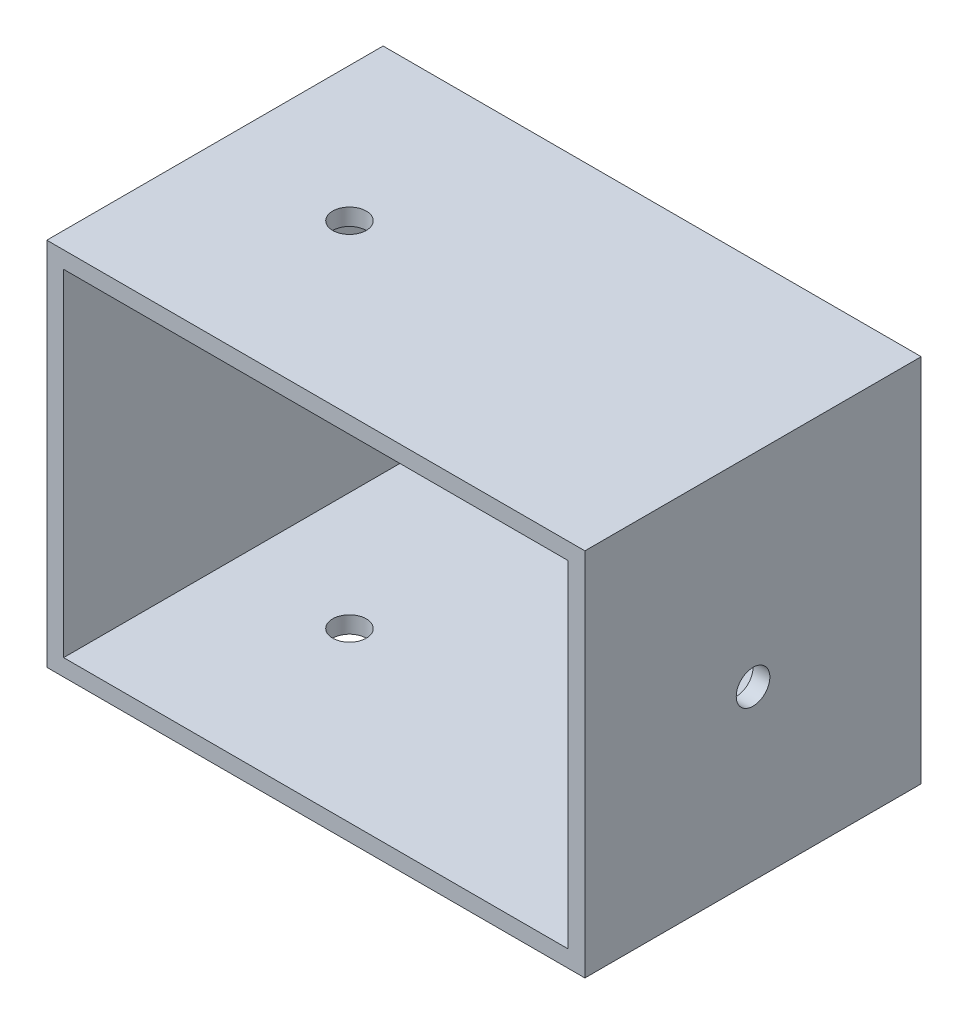
ISO-10303-21;
HEADER;
FILE_DESCRIPTION(('STEP AP214'),'2;1');
FILE_NAME('part.step','',(''),(''),'','','');
FILE_SCHEMA(('AUTOMOTIVE_DESIGN { 1 0 10303 214 1 1 1 1 }'));
ENDSEC;
DATA;
#1=APPLICATION_CONTEXT('core data for automotive mechanical design processes');
#2=APPLICATION_PROTOCOL_DEFINITION('international standard','automotive_design',2000,#1);
#3=PRODUCT_CONTEXT('',#1,'mechanical');
#4=PRODUCT('Part','Part','',(#3));
#5=PRODUCT_RELATED_PRODUCT_CATEGORY('part','',(#4));
#6=PRODUCT_DEFINITION_FORMATION('','',#4);
#7=PRODUCT_DEFINITION_CONTEXT('part definition',#1,'design');
#8=PRODUCT_DEFINITION('design','',#6,#7);
#9=PRODUCT_DEFINITION_SHAPE('','',#8);
#10=(LENGTH_UNIT() NAMED_UNIT(*) SI_UNIT(.MILLI.,.METRE.));
#11=(NAMED_UNIT(*) PLANE_ANGLE_UNIT() SI_UNIT($,.RADIAN.));
#12=(NAMED_UNIT(*) SI_UNIT($,.STERADIAN.) SOLID_ANGLE_UNIT());
#13=UNCERTAINTY_MEASURE_WITH_UNIT(LENGTH_MEASURE(1.E-05),#10,'distance_accuracy_value','');
#14=(GEOMETRIC_REPRESENTATION_CONTEXT(3) GLOBAL_UNCERTAINTY_ASSIGNED_CONTEXT((#13)) GLOBAL_UNIT_ASSIGNED_CONTEXT((#10,
#11,#12)) REPRESENTATION_CONTEXT('',''));
#15=CARTESIAN_POINT('',(0.,0.,0.));
#16=DIRECTION('',(0.,0.,1.));
#17=DIRECTION('',(1.,0.,0.));
#18=AXIS2_PLACEMENT_3D('',#15,#16,#17);
#19=CARTESIAN_POINT('',(0.,-5.,100.));
#20=DIRECTION('',(0.,1.,0.));
#21=DIRECTION('',(0.,0.,1.));
#22=AXIS2_PLACEMENT_3D('',#19,#20,#21);
#23=PLANE('',#22);
#24=CARTESIAN_POINT('',(40.,-5.,50.));
#25=DIRECTION('',(0.,1.,0.));
#26=DIRECTION('',(0.,0.,1.));
#27=AXIS2_PLACEMENT_3D('',#24,#25,#26);
#28=CIRCLE('',#27,5.00000000000001);
#29=CARTESIAN_POINT('',(40.,-5.00000000000003,45.));
#30=VERTEX_POINT('',#29);
#31=EDGE_CURVE('E139',#30,#30,#28,.T.);
#32=ORIENTED_EDGE('',*,*,#31,.T.);
#33=EDGE_LOOP('',(#32));
#34=FACE_BOUND('',#33,.T.);
#35=DIRECTION('',(1.,0.,0.));
#36=VECTOR('',#35,1.);
#37=CARTESIAN_POINT('',(0.,-5.,0.));
#38=LINE('',#37,#36);
#39=CARTESIAN_POINT('',(5.,-5.,0.));
#40=VERTEX_POINT('',#39);
#41=CARTESIAN_POINT('',(155.,-5.,0.));
#42=VERTEX_POINT('',#41);
#43=EDGE_CURVE('E147',#40,#42,#38,.T.);
#44=ORIENTED_EDGE('',*,*,#43,.T.);
#45=DIRECTION('',(0.,0.,-1.));
#46=VECTOR('',#45,1.);
#47=CARTESIAN_POINT('',(155.,-5.,100.));
#48=LINE('',#47,#46);
#49=CARTESIAN_POINT('',(155.,-5.,100.));
#50=VERTEX_POINT('',#49);
#51=EDGE_CURVE('E11',#50,#42,#48,.T.);
#52=ORIENTED_EDGE('',*,*,#51,.F.);
#53=DIRECTION('',(1.,0.,0.));
#54=VECTOR('',#53,1.);
#55=CARTESIAN_POINT('',(0.,-5.,100.));
#56=LINE('',#55,#54);
#57=CARTESIAN_POINT('',(5.,-5.,100.));
#58=VERTEX_POINT('',#57);
#59=EDGE_CURVE('E118',#58,#50,#56,.T.);
#60=ORIENTED_EDGE('',*,*,#59,.F.);
#61=DIRECTION('',(0.,0.,-1.));
#62=VECTOR('',#61,1.);
#63=CARTESIAN_POINT('',(5.,-5.,100.));
#64=LINE('',#63,#62);
#65=EDGE_CURVE('E58',#58,#40,#64,.T.);
#66=ORIENTED_EDGE('',*,*,#65,.T.);
#67=EDGE_LOOP('',(#44,#52,#60,#66));
#68=FACE_BOUND('',#67,.T.);
#69=ADVANCED_FACE('F39',(#34,#68),#23,.F.);
#70=CARTESIAN_POINT('',(155.,0.,100.));
#71=DIRECTION('',(1.,0.,0.));
#72=DIRECTION('',(0.,1.,0.));
#73=AXIS2_PLACEMENT_3D('',#70,#71,#72);
#74=PLANE('',#73);
#75=CARTESIAN_POINT('',(155.,-60.,50.));
#76=DIRECTION('',(1.,0.,0.));
#77=DIRECTION('',(0.,1.,0.));
#78=AXIS2_PLACEMENT_3D('',#75,#76,#77);
#79=CIRCLE('',#78,5.);
#80=CARTESIAN_POINT('',(155.,-55.,50.));
#81=VERTEX_POINT('',#80);
#82=EDGE_CURVE('E200',#81,#81,#79,.T.);
#83=ORIENTED_EDGE('',*,*,#82,.T.);
#84=EDGE_LOOP('',(#83));
#85=FACE_BOUND('',#84,.T.);
#86=DIRECTION('',(0.,-1.,0.));
#87=VECTOR('',#86,1.);
#88=CARTESIAN_POINT('',(155.,0.,0.));
#89=LINE('',#88,#87);
#90=CARTESIAN_POINT('',(155.,-105.,0.));
#91=VERTEX_POINT('',#90);
#92=EDGE_CURVE('E124',#42,#91,#89,.T.);
#93=ORIENTED_EDGE('',*,*,#92,.T.);
#94=DIRECTION('',(0.,0.,-1.));
#95=VECTOR('',#94,1.);
#96=CARTESIAN_POINT('',(155.,-105.,100.));
#97=LINE('',#96,#95);
#98=CARTESIAN_POINT('',(155.,-105.,100.));
#99=VERTEX_POINT('',#98);
#100=EDGE_CURVE('E49',#99,#91,#97,.T.);
#101=ORIENTED_EDGE('',*,*,#100,.F.);
#102=DIRECTION('',(0.,-1.,0.));
#103=VECTOR('',#102,1.);
#104=CARTESIAN_POINT('',(155.,0.,100.));
#105=LINE('',#104,#103);
#106=EDGE_CURVE('E112',#50,#99,#105,.T.);
#107=ORIENTED_EDGE('',*,*,#106,.F.);
#108=ORIENTED_EDGE('',*,*,#51,.T.);
#109=EDGE_LOOP('',(#93,#101,#107,#108));
#110=FACE_BOUND('',#109,.T.);
#111=ADVANCED_FACE('F123',(#85,#110),#74,.F.);
#112=CARTESIAN_POINT('',(0.,-105.,100.));
#113=DIRECTION('',(0.,1.,0.));
#114=DIRECTION('',(0.,0.,1.));
#115=AXIS2_PLACEMENT_3D('',#112,#113,#114);
#116=PLANE('',#115);
#117=CARTESIAN_POINT('',(40.,-105.,50.));
#118=DIRECTION('',(0.,1.,0.));
#119=DIRECTION('',(0.,0.,1.));
#120=AXIS2_PLACEMENT_3D('',#117,#118,#119);
#121=CIRCLE('',#120,5.00000000000001);
#122=CARTESIAN_POINT('',(40.,-105.,45.));
#123=VERTEX_POINT('',#122);
#124=EDGE_CURVE('E191',#123,#123,#121,.T.);
#125=ORIENTED_EDGE('',*,*,#124,.F.);
#126=EDGE_LOOP('',(#125));
#127=FACE_BOUND('',#126,.T.);
#128=DIRECTION('',(1.,0.,0.));
#129=VECTOR('',#128,1.);
#130=CARTESIAN_POINT('',(0.,-105.,0.));
#131=LINE('',#130,#129);
#132=CARTESIAN_POINT('',(5.00000000000001,-105.,0.));
#133=VERTEX_POINT('',#132);
#134=EDGE_CURVE('E150',#133,#91,#131,.T.);
#135=ORIENTED_EDGE('',*,*,#134,.F.);
#136=DIRECTION('',(0.,0.,-1.));
#137=VECTOR('',#136,1.);
#138=CARTESIAN_POINT('',(5.00000000000001,-105.,100.));
#139=LINE('',#138,#137);
#140=CARTESIAN_POINT('',(5.00000000000001,-105.,100.));
#141=VERTEX_POINT('',#140);
#142=EDGE_CURVE('E84',#141,#133,#139,.T.);
#143=ORIENTED_EDGE('',*,*,#142,.F.);
#144=DIRECTION('',(1.,0.,0.));
#145=VECTOR('',#144,1.);
#146=CARTESIAN_POINT('',(0.,-105.,100.));
#147=LINE('',#146,#145);
#148=EDGE_CURVE('E117',#141,#99,#147,.T.);
#149=ORIENTED_EDGE('',*,*,#148,.T.);
#150=ORIENTED_EDGE('',*,*,#100,.T.);
#151=EDGE_LOOP('',(#135,#143,#149,#150));
#152=FACE_BOUND('',#151,.T.);
#153=ADVANCED_FACE('F128',(#127,#152),#116,.T.);
#154=CARTESIAN_POINT('',(160.,0.,100.));
#155=DIRECTION('',(1.,0.,0.));
#156=DIRECTION('',(0.,1.,0.));
#157=AXIS2_PLACEMENT_3D('',#154,#155,#156);
#158=PLANE('',#157);
#159=CARTESIAN_POINT('',(160.,-60.,50.));
#160=DIRECTION('',(1.,0.,0.));
#161=DIRECTION('',(0.,1.,0.));
#162=AXIS2_PLACEMENT_3D('',#159,#160,#161);
#163=CIRCLE('',#162,5.);
#164=CARTESIAN_POINT('',(160.,-55.,50.));
#165=VERTEX_POINT('',#164);
#166=EDGE_CURVE('E203',#165,#165,#163,.T.);
#167=ORIENTED_EDGE('',*,*,#166,.F.);
#168=EDGE_LOOP('',(#167));
#169=FACE_BOUND('',#168,.T.);
#170=DIRECTION('',(0.,-1.,0.));
#171=VECTOR('',#170,1.);
#172=CARTESIAN_POINT('',(160.,0.,0.));
#173=LINE('',#172,#171);
#174=CARTESIAN_POINT('',(160.,0.,0.));
#175=VERTEX_POINT('',#174);
#176=CARTESIAN_POINT('',(160.,-110.,0.));
#177=VERTEX_POINT('',#176);
#178=EDGE_CURVE('E135',#175,#177,#173,.T.);
#179=ORIENTED_EDGE('',*,*,#178,.F.);
#180=DIRECTION('',(0.,0.,-1.));
#181=VECTOR('',#180,1.);
#182=CARTESIAN_POINT('',(160.,0.,100.));
#183=LINE('',#182,#181);
#184=CARTESIAN_POINT('',(160.,0.,100.));
#185=VERTEX_POINT('',#184);
#186=EDGE_CURVE('E43',#185,#175,#183,.T.);
#187=ORIENTED_EDGE('',*,*,#186,.F.);
#188=DIRECTION('',(0.,-1.,0.));
#189=VECTOR('',#188,1.);
#190=CARTESIAN_POINT('',(160.,0.,100.));
#191=LINE('',#190,#189);
#192=CARTESIAN_POINT('',(160.,-110.,100.));
#193=VERTEX_POINT('',#192);
#194=EDGE_CURVE('E155',#185,#193,#191,.T.);
#195=ORIENTED_EDGE('',*,*,#194,.T.);
#196=DIRECTION('',(0.,0.,-1.));
#197=VECTOR('',#196,1.);
#198=CARTESIAN_POINT('',(160.,-110.,100.));
#199=LINE('',#198,#197);
#200=EDGE_CURVE('E131',#193,#177,#199,.T.);
#201=ORIENTED_EDGE('',*,*,#200,.T.);
#202=EDGE_LOOP('',(#179,#187,#195,#201));
#203=FACE_BOUND('',#202,.T.);
#204=ADVANCED_FACE('F41',(#169,#203),#158,.T.);
#205=CARTESIAN_POINT('',(0.,0.,100.));
#206=DIRECTION('',(0.,1.,0.));
#207=DIRECTION('',(-1.,0.,0.));
#208=AXIS2_PLACEMENT_3D('',#205,#206,#207);
#209=PLANE('',#208);
#210=CARTESIAN_POINT('',(40.,0.,50.));
#211=DIRECTION('',(0.,1.,0.));
#212=DIRECTION('',(-1.,0.,0.));
#213=AXIS2_PLACEMENT_3D('',#210,#211,#212);
#214=CIRCLE('',#213,5.00000000000001);
#215=CARTESIAN_POINT('',(40.,0.,45.));
#216=VERTEX_POINT('',#215);
#217=EDGE_CURVE('E194',#216,#216,#214,.T.);
#218=ORIENTED_EDGE('',*,*,#217,.F.);
#219=EDGE_LOOP('',(#218));
#220=FACE_BOUND('',#219,.T.);
#221=DIRECTION('',(1.,0.,0.));
#222=VECTOR('',#221,1.);
#223=CARTESIAN_POINT('',(0.,0.,0.));
#224=LINE('',#223,#222);
#225=CARTESIAN_POINT('',(0.,0.,0.));
#226=VERTEX_POINT('',#225);
#227=EDGE_CURVE('E138',#226,#175,#224,.T.);
#228=ORIENTED_EDGE('',*,*,#227,.F.);
#229=DIRECTION('',(0.,0.,-1.));
#230=VECTOR('',#229,1.);
#231=CARTESIAN_POINT('',(0.,0.,100.));
#232=LINE('',#231,#230);
#233=CARTESIAN_POINT('',(0.,0.,100.));
#234=VERTEX_POINT('',#233);
#235=EDGE_CURVE('E161',#234,#226,#232,.T.);
#236=ORIENTED_EDGE('',*,*,#235,.F.);
#237=DIRECTION('',(1.,0.,0.));
#238=VECTOR('',#237,1.);
#239=CARTESIAN_POINT('',(0.,0.,100.));
#240=LINE('',#239,#238);
#241=EDGE_CURVE('E170',#234,#185,#240,.T.);
#242=ORIENTED_EDGE('',*,*,#241,.T.);
#243=ORIENTED_EDGE('',*,*,#186,.T.);
#244=EDGE_LOOP('',(#228,#236,#242,#243));
#245=FACE_BOUND('',#244,.T.);
#246=ADVANCED_FACE('F168',(#220,#245),#209,.T.);
#247=CARTESIAN_POINT('',(0.,0.,100.));
#248=DIRECTION('',(1.,0.,0.));
#249=DIRECTION('',(0.,1.,0.));
#250=AXIS2_PLACEMENT_3D('',#247,#248,#249);
#251=PLANE('',#250);
#252=DIRECTION('',(0.,-1.,0.));
#253=VECTOR('',#252,1.);
#254=CARTESIAN_POINT('',(0.,0.,0.));
#255=LINE('',#254,#253);
#256=CARTESIAN_POINT('',(0.,-110.,0.));
#257=VERTEX_POINT('',#256);
#258=EDGE_CURVE('E142',#226,#257,#255,.T.);
#259=ORIENTED_EDGE('',*,*,#258,.T.);
#260=DIRECTION('',(0.,0.,-1.));
#261=VECTOR('',#260,1.);
#262=CARTESIAN_POINT('',(0.,-110.,100.));
#263=LINE('',#262,#261);
#264=CARTESIAN_POINT('',(0.,-110.,100.));
#265=VERTEX_POINT('',#264);
#266=EDGE_CURVE('E159',#265,#257,#263,.T.);
#267=ORIENTED_EDGE('',*,*,#266,.F.);
#268=DIRECTION('',(0.,-1.,0.));
#269=VECTOR('',#268,1.);
#270=CARTESIAN_POINT('',(0.,0.,100.));
#271=LINE('',#270,#269);
#272=EDGE_CURVE('E183',#234,#265,#271,.T.);
#273=ORIENTED_EDGE('',*,*,#272,.F.);
#274=ORIENTED_EDGE('',*,*,#235,.T.);
#275=EDGE_LOOP('',(#259,#267,#273,#274));
#276=FACE_BOUND('',#275,.T.);
#277=ADVANCED_FACE('F177',(#276),#251,.F.);
#278=CARTESIAN_POINT('',(0.,-110.,100.));
#279=DIRECTION('',(0.,1.,0.));
#280=DIRECTION('',(-1.,0.,0.));
#281=AXIS2_PLACEMENT_3D('',#278,#279,#280);
#282=PLANE('',#281);
#283=CARTESIAN_POINT('',(40.,-110.,50.));
#284=DIRECTION('',(0.,-1.,0.));
#285=DIRECTION('',(0.,0.,-1.));
#286=AXIS2_PLACEMENT_3D('',#283,#284,#285);
#287=CIRCLE('',#286,5.00000000000001);
#288=CARTESIAN_POINT('',(40.,-110.,45.));
#289=VERTEX_POINT('',#288);
#290=EDGE_CURVE('E197',#289,#289,#287,.T.);
#291=ORIENTED_EDGE('',*,*,#290,.F.);
#292=EDGE_LOOP('',(#291));
#293=FACE_BOUND('',#292,.T.);
#294=DIRECTION('',(1.,0.,0.));
#295=VECTOR('',#294,1.);
#296=CARTESIAN_POINT('',(0.,-110.,0.));
#297=LINE('',#296,#295);
#298=EDGE_CURVE('E144',#257,#177,#297,.T.);
#299=ORIENTED_EDGE('',*,*,#298,.T.);
#300=ORIENTED_EDGE('',*,*,#200,.F.);
#301=DIRECTION('',(1.,0.,0.));
#302=VECTOR('',#301,1.);
#303=CARTESIAN_POINT('',(0.,-110.,100.));
#304=LINE('',#303,#302);
#305=EDGE_CURVE('E181',#265,#193,#304,.T.);
#306=ORIENTED_EDGE('',*,*,#305,.F.);
#307=ORIENTED_EDGE('',*,*,#266,.T.);
#308=EDGE_LOOP('',(#299,#300,#306,#307));
#309=FACE_BOUND('',#308,.T.);
#310=ADVANCED_FACE('F180',(#293,#309),#282,.F.);
#311=CARTESIAN_POINT('',(5.,0.,100.));
#312=DIRECTION('',(1.,0.,0.));
#313=DIRECTION('',(0.,1.,0.));
#314=AXIS2_PLACEMENT_3D('',#311,#312,#313);
#315=PLANE('',#314);
#316=DIRECTION('',(0.,-1.,0.));
#317=VECTOR('',#316,1.);
#318=CARTESIAN_POINT('',(5.,0.,0.));
#319=LINE('',#318,#317);
#320=EDGE_CURVE('E152',#40,#133,#319,.T.);
#321=ORIENTED_EDGE('',*,*,#320,.F.);
#322=ORIENTED_EDGE('',*,*,#65,.F.);
#323=DIRECTION('',(0.,-1.,0.));
#324=VECTOR('',#323,1.);
#325=CARTESIAN_POINT('',(5.,0.,100.));
#326=LINE('',#325,#324);
#327=EDGE_CURVE('E129',#58,#141,#326,.T.);
#328=ORIENTED_EDGE('',*,*,#327,.T.);
#329=ORIENTED_EDGE('',*,*,#142,.T.);
#330=EDGE_LOOP('',(#321,#322,#328,#329));
#331=FACE_BOUND('',#330,.T.);
#332=ADVANCED_FACE('F229',(#331),#315,.T.);
#333=CARTESIAN_POINT('',(0.,0.,100.));
#334=DIRECTION('',(0.,0.,1.));
#335=DIRECTION('',(1.,0.,0.));
#336=AXIS2_PLACEMENT_3D('',#333,#334,#335);
#337=PLANE('',#336);
#338=ORIENTED_EDGE('',*,*,#194,.F.);
#339=ORIENTED_EDGE('',*,*,#241,.F.);
#340=ORIENTED_EDGE('',*,*,#272,.T.);
#341=ORIENTED_EDGE('',*,*,#305,.T.);
#342=EDGE_LOOP('',(#338,#339,#340,#341));
#343=FACE_BOUND('',#342,.T.);
#344=ORIENTED_EDGE('',*,*,#59,.T.);
#345=ORIENTED_EDGE('',*,*,#106,.T.);
#346=ORIENTED_EDGE('',*,*,#148,.F.);
#347=ORIENTED_EDGE('',*,*,#327,.F.);
#348=EDGE_LOOP('',(#344,#345,#346,#347));
#349=FACE_BOUND('',#348,.T.);
#350=ADVANCED_FACE('F114',(#343,#349),#337,.T.);
#351=CARTESIAN_POINT('',(0.,0.,0.));
#352=DIRECTION('',(0.,0.,1.));
#353=DIRECTION('',(1.,0.,0.));
#354=AXIS2_PLACEMENT_3D('',#351,#352,#353);
#355=PLANE('',#354);
#356=ORIENTED_EDGE('',*,*,#178,.T.);
#357=ORIENTED_EDGE('',*,*,#298,.F.);
#358=ORIENTED_EDGE('',*,*,#258,.F.);
#359=ORIENTED_EDGE('',*,*,#227,.T.);
#360=EDGE_LOOP('',(#356,#357,#358,#359));
#361=FACE_BOUND('',#360,.T.);
#362=ORIENTED_EDGE('',*,*,#43,.F.);
#363=ORIENTED_EDGE('',*,*,#320,.T.);
#364=ORIENTED_EDGE('',*,*,#134,.T.);
#365=ORIENTED_EDGE('',*,*,#92,.F.);
#366=EDGE_LOOP('',(#362,#363,#364,#365));
#367=FACE_BOUND('',#366,.T.);
#368=ADVANCED_FACE('F174',(#361,#367),#355,.F.);
#369=CARTESIAN_POINT('',(40.,130.,50.));
#370=DIRECTION('',(0.,-1.,0.));
#371=DIRECTION('',(0.,0.,-1.));
#372=AXIS2_PLACEMENT_3D('',#369,#370,#371);
#373=CYLINDRICAL_SURFACE('',#372,5.00000000000001);
#374=CARTESIAN_POINT('',(40.,-105.,45.));
#375=CARTESIAN_POINT('',(40.,-105.052083333333,45.));
#376=CARTESIAN_POINT('',(40.,-105.104166666667,45.));
#377=CARTESIAN_POINT('',(40.,-105.208333333333,45.));
#378=CARTESIAN_POINT('',(40.,-105.260416666667,45.));
#379=CARTESIAN_POINT('',(40.,-105.364583333333,45.));
#380=CARTESIAN_POINT('',(40.,-105.416666666667,45.));
#381=CARTESIAN_POINT('',(40.,-105.520833333333,45.));
#382=CARTESIAN_POINT('',(40.,-105.572916666667,45.));
#383=CARTESIAN_POINT('',(40.,-105.677083333333,45.));
#384=CARTESIAN_POINT('',(40.,-105.729166666667,45.));
#385=CARTESIAN_POINT('',(40.,-105.833333333333,45.));
#386=CARTESIAN_POINT('',(40.,-105.885416666667,45.));
#387=CARTESIAN_POINT('',(40.,-105.989583333333,45.));
#388=CARTESIAN_POINT('',(40.,-106.041666666667,45.));
#389=CARTESIAN_POINT('',(40.,-106.145833333333,45.));
#390=CARTESIAN_POINT('',(40.,-106.197916666667,45.));
#391=CARTESIAN_POINT('',(40.,-106.302083333333,45.));
#392=CARTESIAN_POINT('',(40.,-106.354166666667,45.));
#393=CARTESIAN_POINT('',(40.,-106.458333333333,45.));
#394=CARTESIAN_POINT('',(40.,-106.510416666667,45.));
#395=CARTESIAN_POINT('',(40.,-106.614583333333,45.));
#396=CARTESIAN_POINT('',(40.,-106.666666666667,45.));
#397=CARTESIAN_POINT('',(40.,-106.770833333333,45.));
#398=CARTESIAN_POINT('',(40.,-106.822916666667,45.));
#399=CARTESIAN_POINT('',(40.,-106.927083333333,45.));
#400=CARTESIAN_POINT('',(40.,-106.979166666667,45.));
#401=CARTESIAN_POINT('',(40.,-107.083333333333,45.));
#402=CARTESIAN_POINT('',(40.,-107.135416666667,45.));
#403=CARTESIAN_POINT('',(40.,-107.239583333333,45.));
#404=CARTESIAN_POINT('',(40.,-107.291666666667,45.));
#405=CARTESIAN_POINT('',(40.,-107.395833333333,45.));
#406=CARTESIAN_POINT('',(40.,-107.447916666667,45.));
#407=CARTESIAN_POINT('',(40.,-107.552083333333,45.));
#408=CARTESIAN_POINT('',(40.,-107.604166666667,45.));
#409=CARTESIAN_POINT('',(40.,-107.708333333333,45.));
#410=CARTESIAN_POINT('',(40.,-107.760416666667,45.));
#411=CARTESIAN_POINT('',(40.,-107.864583333333,45.));
#412=CARTESIAN_POINT('',(40.,-107.916666666667,45.));
#413=CARTESIAN_POINT('',(40.,-108.020833333333,45.));
#414=CARTESIAN_POINT('',(40.,-108.072916666667,45.));
#415=CARTESIAN_POINT('',(40.,-108.177083333333,45.));
#416=CARTESIAN_POINT('',(40.,-108.229166666667,45.));
#417=CARTESIAN_POINT('',(40.,-108.333333333333,45.));
#418=CARTESIAN_POINT('',(40.,-108.385416666667,45.));
#419=CARTESIAN_POINT('',(40.,-108.489583333333,45.));
#420=CARTESIAN_POINT('',(40.,-108.541666666667,45.));
#421=CARTESIAN_POINT('',(40.,-108.645833333333,45.));
#422=CARTESIAN_POINT('',(40.,-108.697916666667,45.));
#423=CARTESIAN_POINT('',(40.,-108.802083333333,45.));
#424=CARTESIAN_POINT('',(40.,-108.854166666667,45.));
#425=CARTESIAN_POINT('',(40.,-108.958333333333,45.));
#426=CARTESIAN_POINT('',(40.,-109.010416666667,45.));
#427=CARTESIAN_POINT('',(40.,-109.114583333333,45.));
#428=CARTESIAN_POINT('',(40.,-109.166666666667,45.));
#429=CARTESIAN_POINT('',(40.,-109.270833333333,45.));
#430=CARTESIAN_POINT('',(40.,-109.322916666667,45.));
#431=CARTESIAN_POINT('',(40.,-109.427083333333,45.));
#432=CARTESIAN_POINT('',(40.,-109.479166666667,45.));
#433=CARTESIAN_POINT('',(40.,-109.583333333333,45.));
#434=CARTESIAN_POINT('',(40.,-109.635416666667,45.));
#435=CARTESIAN_POINT('',(40.,-109.739583333333,45.));
#436=CARTESIAN_POINT('',(40.,-109.791666666667,45.));
#437=CARTESIAN_POINT('',(40.,-109.895833333333,45.));
#438=CARTESIAN_POINT('',(40.,-109.947916666667,45.));
#439=CARTESIAN_POINT('',(40.,-110.,45.));
#440=B_SPLINE_CURVE_WITH_KNOTS('',3,(#374,#375,#376,#377,#378,#379,#380,#381,#382,#383,#384,
#385,#386,#387,#388,#389,#390,#391,#392,#393,#394,#395,#396,#397,#398,#399,#400,#401,#402,#403,
#404,#405,#406,#407,#408,#409,#410,#411,#412,#413,#414,#415,#416,#417,#418,#419,#420,#421,#422,
#423,#424,#425,#426,#427,#428,#429,#430,#431,#432,#433,#434,#435,#436,#437,#438,#439),
.UNSPECIFIED.,.F.,.F.,(4,2,2,2,2,2,2,2,2,2,2,2,2,2,2,2,2,2,2,2,2,2,2,2,2,2,2,2,2,2,2,2,4),(0.,
0.156249999999997,0.312499999999993,0.46874999999999,0.624999999999987,0.781249999999983,
0.93749999999998,1.09374999999998,1.24999999999997,1.40625,1.56249999999999,1.71874999999999,
1.87499999999999,2.03124999999998,2.18749999999998,2.34374999999998,2.49999999999997,
2.65624999999997,2.81249999999997,2.96874999999996,3.12499999999996,3.28124999999996,
3.43749999999995,3.59374999999995,3.74999999999998,3.90624999999997,4.06249999999997,
4.21874999999997,4.37499999999996,4.53124999999996,4.68749999999996,4.84374999999995,
4.99999999999995),.UNSPECIFIED.);
#441=EDGE_CURVE('BSEAM259',#123,#289,#440,.T.);
#442=ORIENTED_EDGE('',*,*,#124,.T.);
#443=ORIENTED_EDGE('',*,*,#290,.T.);
#444=ORIENTED_EDGE('',*,*,#441,.T.);
#445=ORIENTED_EDGE('',*,*,#441,.F.);
#446=EDGE_LOOP('',(#442,#444,#443,#445));
#447=FACE_BOUND('',#446,.T.);
#448=ADVANCED_FACE('F259',(#447),#373,.F.);
#449=CARTESIAN_POINT('',(40.,0.,45.));
#450=CARTESIAN_POINT('',(40.,-0.0520833333333599,45.));
#451=CARTESIAN_POINT('',(40.,-0.104166666666692,45.));
#452=CARTESIAN_POINT('',(40.,-0.208333333333357,45.));
#453=CARTESIAN_POINT('',(40.,-0.260416666666689,45.));
#454=CARTESIAN_POINT('',(40.,-0.364583333333353,45.));
#455=CARTESIAN_POINT('',(40.,-0.416666666666686,45.));
#456=CARTESIAN_POINT('',(40.,-0.52083333333335,45.));
#457=CARTESIAN_POINT('',(40.,-0.572916666666682,45.));
#458=CARTESIAN_POINT('',(40.,-0.677083333333356,45.));
#459=CARTESIAN_POINT('',(40.,-0.729166666666697,45.));
#460=CARTESIAN_POINT('',(40.,-0.833333333333371,45.));
#461=CARTESIAN_POINT('',(40.,-0.885416666666703,45.));
#462=CARTESIAN_POINT('',(40.,-0.989583333333368,45.));
#463=CARTESIAN_POINT('',(40.,-1.0416666666667,45.));
#464=CARTESIAN_POINT('',(40.,-1.14583333333336,45.));
#465=CARTESIAN_POINT('',(40.,-1.1979166666667,45.));
#466=CARTESIAN_POINT('',(40.,-1.30208333333336,45.));
#467=CARTESIAN_POINT('',(40.,-1.35416666666669,45.));
#468=CARTESIAN_POINT('',(40.,-1.45833333333336,45.));
#469=CARTESIAN_POINT('',(40.,-1.51041666666669,45.));
#470=CARTESIAN_POINT('',(40.,-1.61458333333335,45.));
#471=CARTESIAN_POINT('',(40.,-1.66666666666669,45.));
#472=CARTESIAN_POINT('',(40.,-1.77083333333336,45.));
#473=CARTESIAN_POINT('',(40.,-1.8229166666667,45.));
#474=CARTESIAN_POINT('',(40.,-1.92708333333338,45.));
#475=CARTESIAN_POINT('',(40.,-1.97916666666671,45.));
#476=CARTESIAN_POINT('',(40.,-2.08333333333337,45.));
#477=CARTESIAN_POINT('',(40.,-2.1354166666667,45.));
#478=CARTESIAN_POINT('',(40.,-2.23958333333337,45.));
#479=CARTESIAN_POINT('',(40.,-2.2916666666667,45.));
#480=CARTESIAN_POINT('',(40.,-2.39583333333337,45.));
#481=CARTESIAN_POINT('',(40.,-2.4479166666667,45.));
#482=CARTESIAN_POINT('',(40.,-2.55208333333336,45.));
#483=CARTESIAN_POINT('',(40.,-2.60416666666669,45.));
#484=CARTESIAN_POINT('',(40.,-2.70833333333336,45.));
#485=CARTESIAN_POINT('',(40.,-2.76041666666669,45.));
#486=CARTESIAN_POINT('',(40.,-2.86458333333336,45.));
#487=CARTESIAN_POINT('',(40.,-2.91666666666669,45.));
#488=CARTESIAN_POINT('',(40.,-3.02083333333335,45.));
#489=CARTESIAN_POINT('',(40.,-3.07291666666668,45.));
#490=CARTESIAN_POINT('',(40.,-3.17708333333336,45.));
#491=CARTESIAN_POINT('',(40.,-3.2291666666667,45.));
#492=CARTESIAN_POINT('',(40.,-3.33333333333337,45.));
#493=CARTESIAN_POINT('',(40.,-3.38541666666671,45.));
#494=CARTESIAN_POINT('',(40.,-3.48958333333337,45.));
#495=CARTESIAN_POINT('',(40.,-3.5416666666667,45.));
#496=CARTESIAN_POINT('',(40.,-3.64583333333337,45.));
#497=CARTESIAN_POINT('',(40.,-3.6979166666667,45.));
#498=CARTESIAN_POINT('',(40.,-3.80208333333336,45.));
#499=CARTESIAN_POINT('',(40.,-3.8541666666667,45.));
#500=CARTESIAN_POINT('',(40.,-3.95833333333336,45.));
#501=CARTESIAN_POINT('',(40.,-4.01041666666669,45.));
#502=CARTESIAN_POINT('',(40.,-4.11458333333336,45.));
#503=CARTESIAN_POINT('',(40.,-4.16666666666669,45.));
#504=CARTESIAN_POINT('',(40.,-4.27083333333336,45.));
#505=CARTESIAN_POINT('',(40.,-4.3229166666667,45.));
#506=CARTESIAN_POINT('',(40.,-4.42708333333338,45.));
#507=CARTESIAN_POINT('',(40.,-4.47916666666671,45.));
#508=CARTESIAN_POINT('',(40.,-4.58333333333337,45.));
#509=CARTESIAN_POINT('',(40.,-4.63541666666671,45.));
#510=CARTESIAN_POINT('',(40.,-4.73958333333337,45.));
#511=CARTESIAN_POINT('',(40.,-4.7916666666667,45.));
#512=CARTESIAN_POINT('',(40.,-4.89583333333337,45.));
#513=CARTESIAN_POINT('',(40.,-4.9479166666667,45.));
#514=CARTESIAN_POINT('',(40.,-5.00000000000003,45.));
#515=B_SPLINE_CURVE_WITH_KNOTS('',3,(#449,#450,#451,#452,#453,#454,#455,#456,#457,#458,#459,
#460,#461,#462,#463,#464,#465,#466,#467,#468,#469,#470,#471,#472,#473,#474,#475,#476,#477,#478,
#479,#480,#481,#482,#483,#484,#485,#486,#487,#488,#489,#490,#491,#492,#493,#494,#495,#496,#497,
#498,#499,#500,#501,#502,#503,#504,#505,#506,#507,#508,#509,#510,#511,#512,#513,#514),
.UNSPECIFIED.,.F.,.F.,(4,2,2,2,2,2,2,2,2,2,2,2,2,2,2,2,2,2,2,2,2,2,2,2,2,2,2,2,2,2,2,2,4),(0.,
0.156249999999997,0.312499999999993,0.46874999999999,0.624999999999987,0.781250000000011,
0.937500000000008,1.09375,1.25,1.40625,1.56249999999999,1.71874999999999,1.87500000000002,
2.03125000000001,2.18750000000001,2.34375000000001,2.5,2.65625,2.8125,2.96874999999999,
3.12499999999999,3.28125000000001,3.43750000000001,3.59375000000001,3.75,3.90625,4.0625,
4.21874999999999,4.37500000000002,4.53125000000001,4.68750000000001,4.84375000000001,5.),.UNSPECIFIED.);
#516=EDGE_CURVE('BSEAM265',#216,#30,#515,.T.);
#517=ORIENTED_EDGE('',*,*,#217,.T.);
#518=ORIENTED_EDGE('',*,*,#31,.F.);
#519=ORIENTED_EDGE('',*,*,#516,.T.);
#520=ORIENTED_EDGE('',*,*,#516,.F.);
#521=EDGE_LOOP('',(#517,#519,#518,#520));
#522=FACE_BOUND('',#521,.T.);
#523=ADVANCED_FACE('F265',(#522),#373,.F.);
#524=CARTESIAN_POINT('',(150.,-60.,50.));
#525=DIRECTION('',(1.,0.,0.));
#526=DIRECTION('',(0.,1.,0.));
#527=AXIS2_PLACEMENT_3D('',#524,#525,#526);
#528=CYLINDRICAL_SURFACE('',#527,5.);
#529=ORIENTED_EDGE('',*,*,#166,.T.);
#530=EDGE_LOOP('',(#529));
#531=FACE_BOUND('',#530,.T.);
#532=ORIENTED_EDGE('',*,*,#82,.F.);
#533=EDGE_LOOP('',(#532));
#534=FACE_BOUND('',#533,.T.);
#535=ADVANCED_FACE('F207',(#531,#534),#528,.F.);
#536=CLOSED_SHELL('',(#69,#111,#153,#204,#246,#277,#310,#332,#350,#368,#448,#523,#535));
#537=MANIFOLD_SOLID_BREP('B2',#536);
#538=ADVANCED_BREP_SHAPE_REPRESENTATION('',(#18,#537),#14);
#539=SHAPE_DEFINITION_REPRESENTATION(#9,#538);
ENDSEC;
END-ISO-10303-21;
